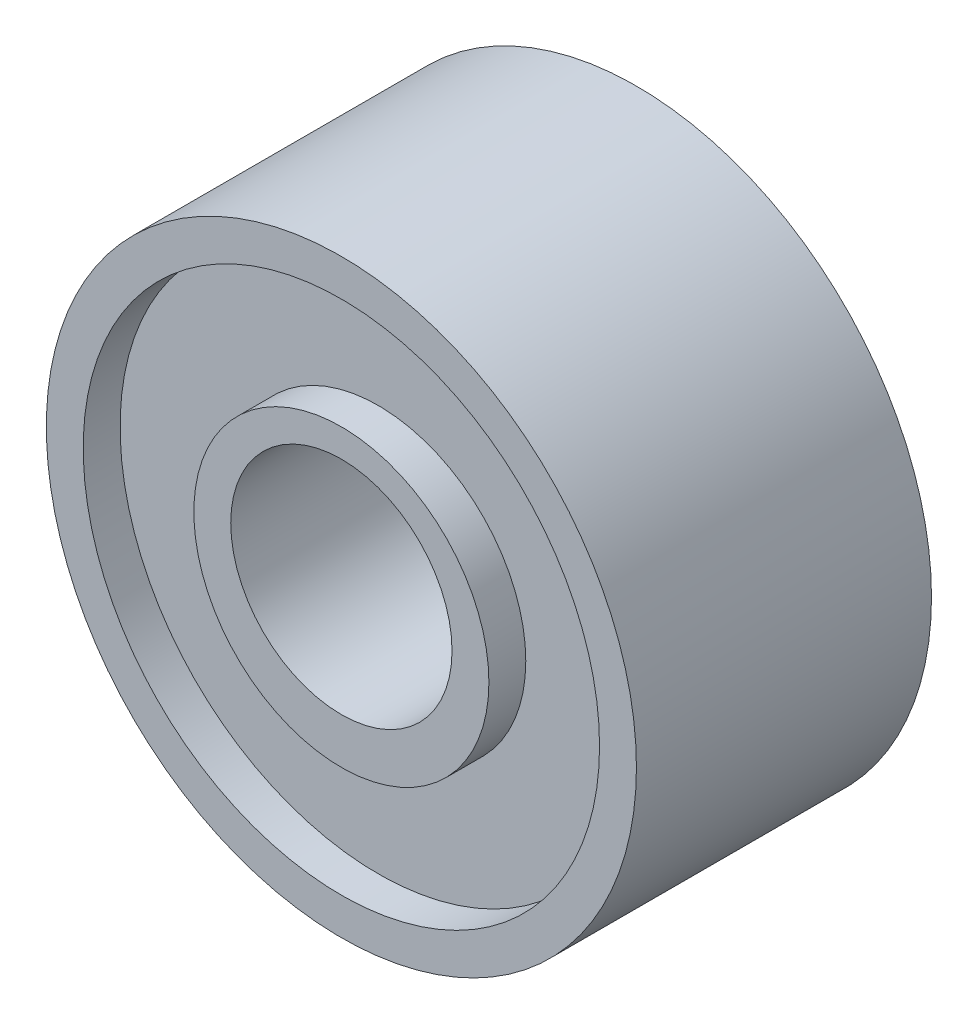
ISO-10303-21;
HEADER;
FILE_DESCRIPTION(('STEP AP214'),'2;1');
FILE_NAME('part.step','',(''),(''),'','','');
FILE_SCHEMA(('AUTOMOTIVE_DESIGN { 1 0 10303 214 1 1 1 1 }'));
ENDSEC;
DATA;
#1=APPLICATION_CONTEXT('core data for automotive mechanical design processes');
#2=APPLICATION_PROTOCOL_DEFINITION('international standard','automotive_design',2000,#1);
#3=PRODUCT_CONTEXT('',#1,'mechanical');
#4=PRODUCT('Part','Part','',(#3));
#5=PRODUCT_RELATED_PRODUCT_CATEGORY('part','',(#4));
#6=PRODUCT_DEFINITION_FORMATION('','',#4);
#7=PRODUCT_DEFINITION_CONTEXT('part definition',#1,'design');
#8=PRODUCT_DEFINITION('design','',#6,#7);
#9=PRODUCT_DEFINITION_SHAPE('','',#8);
#10=(LENGTH_UNIT() NAMED_UNIT(*) SI_UNIT(.MILLI.,.METRE.));
#11=(NAMED_UNIT(*) PLANE_ANGLE_UNIT() SI_UNIT($,.RADIAN.));
#12=(NAMED_UNIT(*) SI_UNIT($,.STERADIAN.) SOLID_ANGLE_UNIT());
#13=UNCERTAINTY_MEASURE_WITH_UNIT(LENGTH_MEASURE(1.E-05),#10,'distance_accuracy_value','');
#14=(GEOMETRIC_REPRESENTATION_CONTEXT(3) GLOBAL_UNCERTAINTY_ASSIGNED_CONTEXT((#13)) GLOBAL_UNIT_ASSIGNED_CONTEXT((#10,
#11,#12)) REPRESENTATION_CONTEXT('',''));
#15=CARTESIAN_POINT('',(0.,0.,0.));
#16=DIRECTION('',(0.,0.,1.));
#17=DIRECTION('',(1.,0.,0.));
#18=AXIS2_PLACEMENT_3D('',#15,#16,#17);
#19=CARTESIAN_POINT('',(0.,0.,0.));
#20=DIRECTION('',(0.,0.,1.));
#21=DIRECTION('',(1.,0.,0.));
#22=AXIS2_PLACEMENT_3D('',#19,#20,#21);
#23=PLANE('',#22);
#24=CARTESIAN_POINT('',(0.,0.12016543490669,0.));
#25=DIRECTION('',(0.,0.,1.));
#26=DIRECTION('',(1.,0.,0.));
#27=AXIS2_PLACEMENT_3D('',#24,#25,#26);
#28=CIRCLE('',#27,1.5);
#29=CARTESIAN_POINT('',(1.5,0.12016543490669,0.));
#30=VERTEX_POINT('',#29);
#31=EDGE_CURVE('E50',#30,#30,#28,.T.);
#32=ORIENTED_EDGE('',*,*,#31,.T.);
#33=EDGE_LOOP('',(#32));
#34=FACE_BOUND('',#33,.T.);
#35=CARTESIAN_POINT('',(0.,0.,0.));
#36=DIRECTION('',(0.,0.,-1.));
#37=DIRECTION('',(-1.,0.,0.));
#38=AXIS2_PLACEMENT_3D('',#35,#36,#37);
#39=CIRCLE('',#38,2.);
#40=CARTESIAN_POINT('',(-2.,0.,0.));
#41=VERTEX_POINT('',#40);
#42=EDGE_CURVE('E74',#41,#41,#39,.T.);
#43=ORIENTED_EDGE('',*,*,#42,.T.);
#44=EDGE_LOOP('',(#43));
#45=FACE_BOUND('',#44,.T.);
#46=ADVANCED_FACE('F37',(#34,#45),#23,.F.);
#47=CARTESIAN_POINT('',(0.,0.,4.));
#48=DIRECTION('',(0.,0.,1.));
#49=DIRECTION('',(1.,0.,0.));
#50=AXIS2_PLACEMENT_3D('',#47,#48,#49);
#51=PLANE('',#50);
#52=CARTESIAN_POINT('',(0.,0.12016543490669,4.));
#53=DIRECTION('',(0.,0.,1.));
#54=DIRECTION('',(1.,0.,0.));
#55=AXIS2_PLACEMENT_3D('',#52,#53,#54);
#56=CIRCLE('',#55,1.5);
#57=CARTESIAN_POINT('',(1.5,0.12016543490669,4.));
#58=VERTEX_POINT('',#57);
#59=EDGE_CURVE('E48',#58,#58,#56,.T.);
#60=ORIENTED_EDGE('',*,*,#59,.F.);
#61=EDGE_LOOP('',(#60));
#62=FACE_BOUND('',#61,.T.);
#63=CARTESIAN_POINT('',(0.,0.,4.));
#64=DIRECTION('',(0.,0.,1.));
#65=DIRECTION('',(1.,0.,0.));
#66=AXIS2_PLACEMENT_3D('',#63,#64,#65);
#67=CIRCLE('',#66,2.);
#68=CARTESIAN_POINT('',(2.,0.,4.));
#69=VERTEX_POINT('',#68);
#70=EDGE_CURVE('E62',#69,#69,#67,.T.);
#71=ORIENTED_EDGE('',*,*,#70,.T.);
#72=EDGE_LOOP('',(#71));
#73=FACE_BOUND('',#72,.T.);
#74=ADVANCED_FACE('F112',(#62,#73),#51,.T.);
#75=CARTESIAN_POINT('',(0.,0.,4.));
#76=DIRECTION('',(0.,0.,1.));
#77=DIRECTION('',(1.,0.,0.));
#78=AXIS2_PLACEMENT_3D('',#75,#76,#77);
#79=CIRCLE('',#78,3.5);
#80=CARTESIAN_POINT('',(3.5,0.,4.));
#81=VERTEX_POINT('',#80);
#82=EDGE_CURVE('E56',#81,#81,#79,.T.);
#83=ORIENTED_EDGE('',*,*,#82,.F.);
#84=EDGE_LOOP('',(#83));
#85=FACE_BOUND('',#84,.T.);
#86=CARTESIAN_POINT('',(0.,0.,4.));
#87=DIRECTION('',(0.,0.,1.));
#88=DIRECTION('',(1.,0.,0.));
#89=AXIS2_PLACEMENT_3D('',#86,#87,#88);
#90=CIRCLE('',#89,4.);
#91=CARTESIAN_POINT('',(4.,0.,4.));
#92=VERTEX_POINT('',#91);
#93=EDGE_CURVE('E10',#92,#92,#90,.T.);
#94=ORIENTED_EDGE('',*,*,#93,.T.);
#95=EDGE_LOOP('',(#94));
#96=FACE_BOUND('',#95,.T.);
#97=ADVANCED_FACE('F99',(#85,#96),#51,.T.);
#98=CARTESIAN_POINT('',(0.,0.,0.));
#99=DIRECTION('',(0.,0.,-1.));
#100=DIRECTION('',(-1.,0.,0.));
#101=AXIS2_PLACEMENT_3D('',#98,#99,#100);
#102=CIRCLE('',#101,3.5);
#103=CARTESIAN_POINT('',(-3.5,0.,0.));
#104=VERTEX_POINT('',#103);
#105=EDGE_CURVE('E68',#104,#104,#102,.T.);
#106=ORIENTED_EDGE('',*,*,#105,.F.);
#107=EDGE_LOOP('',(#106));
#108=FACE_BOUND('',#107,.T.);
#109=CARTESIAN_POINT('',(0.,0.,0.));
#110=DIRECTION('',(0.,0.,1.));
#111=DIRECTION('',(1.,0.,0.));
#112=AXIS2_PLACEMENT_3D('',#109,#110,#111);
#113=CIRCLE('',#112,4.);
#114=CARTESIAN_POINT('',(4.,0.,0.));
#115=VERTEX_POINT('',#114);
#116=EDGE_CURVE('E41',#115,#115,#113,.T.);
#117=ORIENTED_EDGE('',*,*,#116,.F.);
#118=EDGE_LOOP('',(#117));
#119=FACE_BOUND('',#118,.T.);
#120=ADVANCED_FACE('F96',(#108,#119),#23,.F.);
#121=CARTESIAN_POINT('',(0.,0.,4.));
#122=DIRECTION('',(0.,0.,-1.));
#123=DIRECTION('',(-1.,0.,0.));
#124=AXIS2_PLACEMENT_3D('',#121,#122,#123);
#125=CYLINDRICAL_SURFACE('',#124,4.);
#126=ORIENTED_EDGE('',*,*,#93,.F.);
#127=EDGE_LOOP('',(#126));
#128=FACE_BOUND('',#127,.T.);
#129=ORIENTED_EDGE('',*,*,#116,.T.);
#130=EDGE_LOOP('',(#129));
#131=FACE_BOUND('',#130,.T.);
#132=ADVANCED_FACE('F39',(#128,#131),#125,.T.);
#133=CARTESIAN_POINT('',(0.,0.12016543490669,4.));
#134=DIRECTION('',(0.,0.,-1.));
#135=DIRECTION('',(-1.,0.,0.));
#136=AXIS2_PLACEMENT_3D('',#133,#134,#135);
#137=CYLINDRICAL_SURFACE('',#136,1.5);
#138=ORIENTED_EDGE('',*,*,#59,.T.);
#139=EDGE_LOOP('',(#138));
#140=FACE_BOUND('',#139,.T.);
#141=ORIENTED_EDGE('',*,*,#31,.F.);
#142=EDGE_LOOP('',(#141));
#143=FACE_BOUND('',#142,.T.);
#144=ADVANCED_FACE('F103',(#140,#143),#137,.F.);
#145=CARTESIAN_POINT('',(0.,0.,3.5));
#146=DIRECTION('',(0.,0.,1.));
#147=DIRECTION('',(1.,0.,0.));
#148=AXIS2_PLACEMENT_3D('',#145,#146,#147);
#149=CYLINDRICAL_SURFACE('',#148,3.5);
#150=CARTESIAN_POINT('',(0.,0.,3.5));
#151=DIRECTION('',(0.,0.,1.));
#152=DIRECTION('',(1.,0.,0.));
#153=AXIS2_PLACEMENT_3D('',#150,#151,#152);
#154=CIRCLE('',#153,3.5);
#155=CARTESIAN_POINT('',(3.5,0.,3.5));
#156=VERTEX_POINT('',#155);
#157=EDGE_CURVE('E53',#156,#156,#154,.T.);
#158=ORIENTED_EDGE('',*,*,#157,.F.);
#159=EDGE_LOOP('',(#158));
#160=FACE_BOUND('',#159,.T.);
#161=ORIENTED_EDGE('',*,*,#82,.T.);
#162=EDGE_LOOP('',(#161));
#163=FACE_BOUND('',#162,.T.);
#164=ADVANCED_FACE('F108',(#160,#163),#149,.F.);
#165=CARTESIAN_POINT('',(0.,0.,3.5));
#166=DIRECTION('',(0.,0.,1.));
#167=DIRECTION('',(1.,0.,0.));
#168=AXIS2_PLACEMENT_3D('',#165,#166,#167);
#169=PLANE('',#168);
#170=CARTESIAN_POINT('',(0.,0.,3.5));
#171=DIRECTION('',(0.,0.,1.));
#172=DIRECTION('',(1.,0.,0.));
#173=AXIS2_PLACEMENT_3D('',#170,#171,#172);
#174=CIRCLE('',#173,2.);
#175=CARTESIAN_POINT('',(2.,0.,3.5));
#176=VERTEX_POINT('',#175);
#177=EDGE_CURVE('E59',#176,#176,#174,.T.);
#178=ORIENTED_EDGE('',*,*,#177,.F.);
#179=EDGE_LOOP('',(#178));
#180=FACE_BOUND('',#179,.T.);
#181=ORIENTED_EDGE('',*,*,#157,.T.);
#182=EDGE_LOOP('',(#181));
#183=FACE_BOUND('',#182,.T.);
#184=ADVANCED_FACE('F125',(#180,#183),#169,.T.);
#185=CARTESIAN_POINT('',(0.,0.,3.5));
#186=DIRECTION('',(0.,0.,1.));
#187=DIRECTION('',(1.,0.,0.));
#188=AXIS2_PLACEMENT_3D('',#185,#186,#187);
#189=CYLINDRICAL_SURFACE('',#188,2.);
#190=ORIENTED_EDGE('',*,*,#177,.T.);
#191=EDGE_LOOP('',(#190));
#192=FACE_BOUND('',#191,.T.);
#193=ORIENTED_EDGE('',*,*,#70,.F.);
#194=EDGE_LOOP('',(#193));
#195=FACE_BOUND('',#194,.T.);
#196=ADVANCED_FACE('F92',(#192,#195),#189,.T.);
#197=CARTESIAN_POINT('',(0.,0.,0.5));
#198=DIRECTION('',(0.,0.,-1.));
#199=DIRECTION('',(-1.,0.,0.));
#200=AXIS2_PLACEMENT_3D('',#197,#198,#199);
#201=CYLINDRICAL_SURFACE('',#200,3.5);
#202=CARTESIAN_POINT('',(0.,0.,0.5));
#203=DIRECTION('',(0.,0.,-1.));
#204=DIRECTION('',(-1.,0.,0.));
#205=AXIS2_PLACEMENT_3D('',#202,#203,#204);
#206=CIRCLE('',#205,3.5);
#207=CARTESIAN_POINT('',(-3.5,0.,0.5));
#208=VERTEX_POINT('',#207);
#209=EDGE_CURVE('E65',#208,#208,#206,.T.);
#210=ORIENTED_EDGE('',*,*,#209,.F.);
#211=EDGE_LOOP('',(#210));
#212=FACE_BOUND('',#211,.T.);
#213=ORIENTED_EDGE('',*,*,#105,.T.);
#214=EDGE_LOOP('',(#213));
#215=FACE_BOUND('',#214,.T.);
#216=ADVANCED_FACE('F86',(#212,#215),#201,.F.);
#217=CARTESIAN_POINT('',(0.,0.,0.5));
#218=DIRECTION('',(0.,0.,-1.));
#219=DIRECTION('',(-1.,0.,0.));
#220=AXIS2_PLACEMENT_3D('',#217,#218,#219);
#221=PLANE('',#220);
#222=CARTESIAN_POINT('',(0.,0.,0.5));
#223=DIRECTION('',(0.,0.,-1.));
#224=DIRECTION('',(-1.,0.,0.));
#225=AXIS2_PLACEMENT_3D('',#222,#223,#224);
#226=CIRCLE('',#225,2.);
#227=CARTESIAN_POINT('',(-2.,0.,0.5));
#228=VERTEX_POINT('',#227);
#229=EDGE_CURVE('E71',#228,#228,#226,.T.);
#230=ORIENTED_EDGE('',*,*,#229,.F.);
#231=EDGE_LOOP('',(#230));
#232=FACE_BOUND('',#231,.T.);
#233=ORIENTED_EDGE('',*,*,#209,.T.);
#234=EDGE_LOOP('',(#233));
#235=FACE_BOUND('',#234,.T.);
#236=ADVANCED_FACE('F83',(#232,#235),#221,.T.);
#237=CARTESIAN_POINT('',(0.,0.,0.5));
#238=DIRECTION('',(0.,0.,-1.));
#239=DIRECTION('',(-1.,0.,0.));
#240=AXIS2_PLACEMENT_3D('',#237,#238,#239);
#241=CYLINDRICAL_SURFACE('',#240,2.);
#242=ORIENTED_EDGE('',*,*,#229,.T.);
#243=EDGE_LOOP('',(#242));
#244=FACE_BOUND('',#243,.T.);
#245=ORIENTED_EDGE('',*,*,#42,.F.);
#246=EDGE_LOOP('',(#245));
#247=FACE_BOUND('',#246,.T.);
#248=ADVANCED_FACE('F80',(#244,#247),#241,.T.);
#249=CLOSED_SHELL('',(#46,#74,#97,#120,#132,#144,#164,#184,#196,#216,#236,#248));
#250=MANIFOLD_SOLID_BREP('B2',#249);
#251=ADVANCED_BREP_SHAPE_REPRESENTATION('',(#18,#250),#14);
#252=SHAPE_DEFINITION_REPRESENTATION(#9,#251);
ENDSEC;
END-ISO-10303-21;
